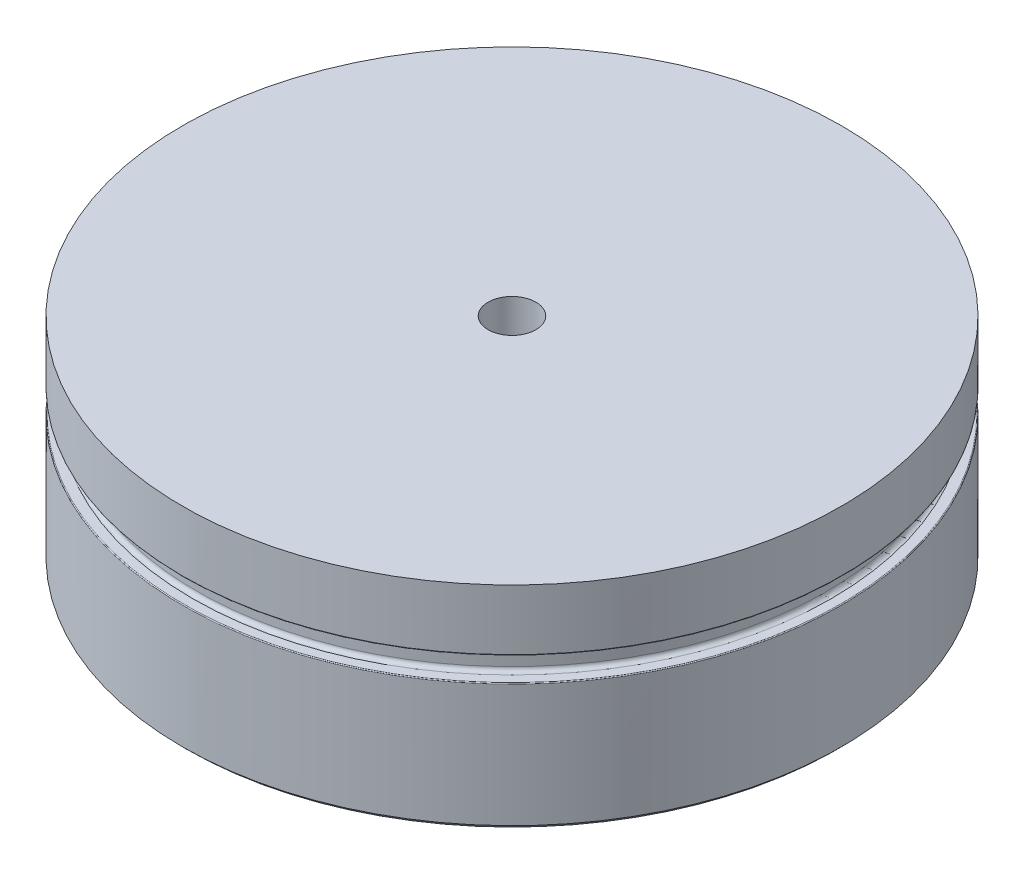
ISO-10303-21;
HEADER;
FILE_DESCRIPTION(('STEP AP214'),'2;1');
FILE_NAME('part.step','',(''),(''),'','','');
FILE_SCHEMA(('AUTOMOTIVE_DESIGN { 1 0 10303 214 1 1 1 1 }'));
ENDSEC;
DATA;
#1=APPLICATION_CONTEXT('core data for automotive mechanical design processes');
#2=APPLICATION_PROTOCOL_DEFINITION('international standard','automotive_design',2000,#1);
#3=PRODUCT_CONTEXT('',#1,'mechanical');
#4=PRODUCT('Part','Part','',(#3));
#5=PRODUCT_RELATED_PRODUCT_CATEGORY('part','',(#4));
#6=PRODUCT_DEFINITION_FORMATION('','',#4);
#7=PRODUCT_DEFINITION_CONTEXT('part definition',#1,'design');
#8=PRODUCT_DEFINITION('design','',#6,#7);
#9=PRODUCT_DEFINITION_SHAPE('','',#8);
#10=(LENGTH_UNIT() NAMED_UNIT(*) SI_UNIT(.MILLI.,.METRE.));
#11=(NAMED_UNIT(*) PLANE_ANGLE_UNIT() SI_UNIT($,.RADIAN.));
#12=(NAMED_UNIT(*) SI_UNIT($,.STERADIAN.) SOLID_ANGLE_UNIT());
#13=UNCERTAINTY_MEASURE_WITH_UNIT(LENGTH_MEASURE(1.E-05),#10,'distance_accuracy_value','');
#14=(GEOMETRIC_REPRESENTATION_CONTEXT(3) GLOBAL_UNCERTAINTY_ASSIGNED_CONTEXT((#13)) GLOBAL_UNIT_ASSIGNED_CONTEXT((#10,
#11,#12)) REPRESENTATION_CONTEXT('',''));
#15=CARTESIAN_POINT('',(0.,0.,0.));
#16=DIRECTION('',(0.,0.,1.));
#17=DIRECTION('',(1.,0.,0.));
#18=AXIS2_PLACEMENT_3D('',#15,#16,#17);
#19=CARTESIAN_POINT('',(-98.3869,0.,0.));
#20=DIRECTION('',(0.,1.,0.));
#21=DIRECTION('',(0.,0.,1.));
#22=AXIS2_PLACEMENT_3D('',#19,#20,#21);
#23=PLANE('',#22);
#24=CARTESIAN_POINT('',(0.,0.,0.));
#25=DIRECTION('',(0.,-1.,0.));
#26=DIRECTION('',(0.,0.,-1.));
#27=AXIS2_PLACEMENT_3D('',#24,#25,#26);
#28=CIRCLE('',#27,8.5727413);
#29=CARTESIAN_POINT('',(0.,0.,-8.5727413));
#30=VERTEX_POINT('',#29);
#31=EDGE_CURVE('E89',#30,#30,#28,.T.);
#32=ORIENTED_EDGE('',*,*,#31,.F.);
#33=EDGE_LOOP('',(#32));
#34=FACE_BOUND('',#33,.T.);
#35=CARTESIAN_POINT('',(0.,0.,0.));
#36=DIRECTION('',(0.,1.,0.));
#37=DIRECTION('',(0.,0.,1.));
#38=AXIS2_PLACEMENT_3D('',#35,#36,#37);
#39=CIRCLE('',#38,97.1168999999999);
#40=CARTESIAN_POINT('',(0.,0.,97.1168999999999));
#41=VERTEX_POINT('',#40);
#42=EDGE_CURVE('E50',#41,#41,#39,.F.);
#43=ORIENTED_EDGE('',*,*,#42,.T.);
#44=EDGE_LOOP('',(#43));
#45=FACE_BOUND('',#44,.T.);
#46=ADVANCED_FACE('F39',(#34,#45),#23,.F.);
#47=CARTESIAN_POINT('',(0.,63.5,0.));
#48=DIRECTION('',(0.,-1.,0.));
#49=DIRECTION('',(0.,0.,-1.));
#50=AXIS2_PLACEMENT_3D('',#47,#48,#49);
#51=PLANE('',#50);
#52=CARTESIAN_POINT('',(0.,63.5,0.));
#53=DIRECTION('',(0.,-1.,0.));
#54=DIRECTION('',(0.,0.,-1.));
#55=AXIS2_PLACEMENT_3D('',#52,#53,#54);
#56=CIRCLE('',#55,7.1374);
#57=CARTESIAN_POINT('',(0.,63.5,-7.1374));
#58=VERTEX_POINT('',#57);
#59=EDGE_CURVE('E82',#58,#58,#56,.T.);
#60=ORIENTED_EDGE('',*,*,#59,.T.);
#61=EDGE_LOOP('',(#60));
#62=FACE_BOUND('',#61,.T.);
#63=CARTESIAN_POINT('',(0.,63.5,0.));
#64=DIRECTION('',(0.,-1.,0.));
#65=DIRECTION('',(0.,0.,-1.));
#66=AXIS2_PLACEMENT_3D('',#63,#64,#65);
#67=CIRCLE('',#66,98.3869);
#68=CARTESIAN_POINT('',(0.,63.5,-98.3869));
#69=VERTEX_POINT('',#68);
#70=EDGE_CURVE('E76',#69,#69,#67,.T.);
#71=ORIENTED_EDGE('',*,*,#70,.F.);
#72=EDGE_LOOP('',(#71));
#73=FACE_BOUND('',#72,.T.);
#74=ADVANCED_FACE('F100',(#62,#73),#51,.F.);
#75=CARTESIAN_POINT('',(0.,0.,0.));
#76=DIRECTION('',(0.,-1.,0.));
#77=DIRECTION('',(0.,0.,-1.));
#78=AXIS2_PLACEMENT_3D('',#75,#76,#77);
#79=CYLINDRICAL_SURFACE('',#78,98.3869);
#80=CARTESIAN_POINT('',(0.,45.4914,0.));
#81=DIRECTION('',(0.,1.,0.));
#82=DIRECTION('',(0.,0.,1.));
#83=AXIS2_PLACEMENT_3D('',#80,#81,#82);
#84=CIRCLE('',#83,98.3869);
#85=CARTESIAN_POINT('',(0.,45.4914,98.3869));
#86=VERTEX_POINT('',#85);
#87=EDGE_CURVE('E51',#86,#86,#84,.T.);
#88=ORIENTED_EDGE('',*,*,#87,.T.);
#89=EDGE_LOOP('',(#88));
#90=FACE_BOUND('',#89,.T.);
#91=ORIENTED_EDGE('',*,*,#70,.T.);
#92=EDGE_LOOP('',(#91));
#93=FACE_BOUND('',#92,.T.);
#94=ADVANCED_FACE('F103',(#90,#93),#79,.T.);
#95=CARTESIAN_POINT('',(-98.3869,45.2374,0.));
#96=DIRECTION('',(0.,1.,0.));
#97=DIRECTION('',(0.,0.,1.));
#98=AXIS2_PLACEMENT_3D('',#95,#96,#97);
#99=PLANE('',#98);
#100=CARTESIAN_POINT('',(0.,45.2374,0.));
#101=DIRECTION('',(0.,1.,0.));
#102=DIRECTION('',(0.,0.,1.));
#103=AXIS2_PLACEMENT_3D('',#100,#101,#102);
#104=CIRCLE('',#103,98.1329);
#105=CARTESIAN_POINT('',(0.,45.2374,98.1329));
#106=VERTEX_POINT('',#105);
#107=EDGE_CURVE('E54',#106,#106,#104,.F.);
#108=ORIENTED_EDGE('',*,*,#107,.T.);
#109=EDGE_LOOP('',(#108));
#110=FACE_BOUND('',#109,.T.);
#111=CARTESIAN_POINT('',(0.,45.2374,0.));
#112=DIRECTION('',(0.,1.,0.));
#113=DIRECTION('',(0.,0.,1.));
#114=AXIS2_PLACEMENT_3D('',#111,#112,#113);
#115=CIRCLE('',#114,95.377);
#116=CARTESIAN_POINT('',(0.,45.2374,95.377));
#117=VERTEX_POINT('',#116);
#118=EDGE_CURVE('E66',#117,#117,#115,.T.);
#119=ORIENTED_EDGE('',*,*,#118,.T.);
#120=EDGE_LOOP('',(#119));
#121=FACE_BOUND('',#120,.T.);
#122=ADVANCED_FACE('F135',(#110,#121),#99,.F.);
#123=CARTESIAN_POINT('',(0.,0.,0.));
#124=DIRECTION('',(0.,-1.,0.));
#125=DIRECTION('',(0.,0.,-1.));
#126=AXIS2_PLACEMENT_3D('',#123,#124,#125);
#127=CYLINDRICAL_SURFACE('',#126,94.107);
#128=CARTESIAN_POINT('',(0.,43.9674,0.));
#129=DIRECTION('',(0.,1.,0.));
#130=DIRECTION('',(0.,0.,1.));
#131=AXIS2_PLACEMENT_3D('',#128,#129,#130);
#132=CIRCLE('',#131,94.107);
#133=CARTESIAN_POINT('',(0.,43.9674,94.107));
#134=VERTEX_POINT('',#133);
#135=EDGE_CURVE('E75',#134,#134,#132,.F.);
#136=ORIENTED_EDGE('',*,*,#135,.T.);
#137=EDGE_LOOP('',(#136));
#138=FACE_BOUND('',#137,.T.);
#139=CARTESIAN_POINT('',(0.,39.37,0.));
#140=DIRECTION('',(0.,-1.,0.));
#141=DIRECTION('',(0.,0.,-1.));
#142=AXIS2_PLACEMENT_3D('',#139,#140,#141);
#143=CIRCLE('',#142,94.107);
#144=CARTESIAN_POINT('',(0.,39.37,-94.107));
#145=VERTEX_POINT('',#144);
#146=EDGE_CURVE('E73',#145,#145,#143,.F.);
#147=ORIENTED_EDGE('',*,*,#146,.T.);
#148=EDGE_LOOP('',(#147));
#149=FACE_BOUND('',#148,.T.);
#150=ADVANCED_FACE('F134',(#138,#149),#127,.T.);
#151=CARTESIAN_POINT('',(-94.107,38.1,0.));
#152=DIRECTION('',(0.,-1.,0.));
#153=DIRECTION('',(0.,0.,-1.));
#154=AXIS2_PLACEMENT_3D('',#151,#152,#153);
#155=PLANE('',#154);
#156=CARTESIAN_POINT('',(0.,38.1,0.));
#157=DIRECTION('',(0.,-1.,0.));
#158=DIRECTION('',(0.,0.,-1.));
#159=AXIS2_PLACEMENT_3D('',#156,#157,#158);
#160=CIRCLE('',#159,98.1329);
#161=CARTESIAN_POINT('',(0.,38.1,-98.1329));
#162=VERTEX_POINT('',#161);
#163=EDGE_CURVE('E58',#162,#162,#160,.F.);
#164=ORIENTED_EDGE('',*,*,#163,.T.);
#165=EDGE_LOOP('',(#164));
#166=FACE_BOUND('',#165,.T.);
#167=CARTESIAN_POINT('',(0.,38.1,0.));
#168=DIRECTION('',(0.,-1.,0.));
#169=DIRECTION('',(0.,0.,-1.));
#170=AXIS2_PLACEMENT_3D('',#167,#168,#169);
#171=CIRCLE('',#170,95.377);
#172=CARTESIAN_POINT('',(0.,38.1,-95.377));
#173=VERTEX_POINT('',#172);
#174=EDGE_CURVE('E67',#173,#173,#171,.T.);
#175=ORIENTED_EDGE('',*,*,#174,.T.);
#176=EDGE_LOOP('',(#175));
#177=FACE_BOUND('',#176,.T.);
#178=ADVANCED_FACE('F141',(#166,#177),#155,.F.);
#179=CARTESIAN_POINT('',(0.,0.,0.));
#180=DIRECTION('',(0.,-1.,0.));
#181=DIRECTION('',(0.,0.,-1.));
#182=AXIS2_PLACEMENT_3D('',#179,#180,#181);
#183=CYLINDRICAL_SURFACE('',#182,98.3869);
#184=CARTESIAN_POINT('',(0.,1.27000000000004,0.));
#185=DIRECTION('',(0.,1.,0.));
#186=DIRECTION('',(0.,0.,1.));
#187=AXIS2_PLACEMENT_3D('',#184,#185,#186);
#188=CIRCLE('',#187,98.3869);
#189=CARTESIAN_POINT('',(0.,1.27000000000004,98.3869));
#190=VERTEX_POINT('',#189);
#191=EDGE_CURVE('E10',#190,#190,#188,.T.);
#192=ORIENTED_EDGE('',*,*,#191,.T.);
#193=EDGE_LOOP('',(#192));
#194=FACE_BOUND('',#193,.T.);
#195=CARTESIAN_POINT('',(0.,37.846,0.));
#196=DIRECTION('',(0.,-1.,0.));
#197=DIRECTION('',(0.,0.,-1.));
#198=AXIS2_PLACEMENT_3D('',#195,#196,#197);
#199=CIRCLE('',#198,98.3869);
#200=CARTESIAN_POINT('',(0.,37.846,-98.3869));
#201=VERTEX_POINT('',#200);
#202=EDGE_CURVE('E61',#201,#201,#199,.T.);
#203=ORIENTED_EDGE('',*,*,#202,.T.);
#204=EDGE_LOOP('',(#203));
#205=FACE_BOUND('',#204,.T.);
#206=ADVANCED_FACE('F115',(#194,#205),#183,.T.);
#207=CARTESIAN_POINT('',(0.,43.9674,0.));
#208=DIRECTION('',(0.,1.,0.));
#209=DIRECTION('',(0.,0.,1.));
#210=AXIS2_PLACEMENT_3D('',#207,#208,#209);
#211=TOROIDAL_SURFACE('',#210,95.377,1.27);
#212=ORIENTED_EDGE('',*,*,#118,.F.);
#213=EDGE_LOOP('',(#212));
#214=FACE_BOUND('',#213,.T.);
#215=ORIENTED_EDGE('',*,*,#135,.F.);
#216=EDGE_LOOP('',(#215));
#217=FACE_BOUND('',#216,.T.);
#218=ADVANCED_FACE('F107',(#214,#217),#211,.F.);
#219=CARTESIAN_POINT('',(0.,39.37,0.));
#220=DIRECTION('',(0.,-1.,0.));
#221=DIRECTION('',(0.,0.,-1.));
#222=AXIS2_PLACEMENT_3D('',#219,#220,#221);
#223=TOROIDAL_SURFACE('',#222,95.377,1.27);
#224=ORIENTED_EDGE('',*,*,#146,.F.);
#225=EDGE_LOOP('',(#224));
#226=FACE_BOUND('',#225,.T.);
#227=ORIENTED_EDGE('',*,*,#174,.F.);
#228=EDGE_LOOP('',(#227));
#229=FACE_BOUND('',#228,.T.);
#230=ADVANCED_FACE('F112',(#226,#229),#223,.F.);
#231=CARTESIAN_POINT('',(0.,37.846,0.));
#232=DIRECTION('',(0.,-1.,0.));
#233=DIRECTION('',(0.,0.,-1.));
#234=AXIS2_PLACEMENT_3D('',#231,#232,#233);
#235=TOROIDAL_SURFACE('',#234,98.1329,0.254);
#236=ORIENTED_EDGE('',*,*,#163,.F.);
#237=EDGE_LOOP('',(#236));
#238=FACE_BOUND('',#237,.T.);
#239=ORIENTED_EDGE('',*,*,#202,.F.);
#240=EDGE_LOOP('',(#239));
#241=FACE_BOUND('',#240,.T.);
#242=ADVANCED_FACE('F118',(#238,#241),#235,.T.);
#243=CARTESIAN_POINT('',(0.,45.4914,0.));
#244=DIRECTION('',(0.,1.,0.));
#245=DIRECTION('',(0.,0.,1.));
#246=AXIS2_PLACEMENT_3D('',#243,#244,#245);
#247=TOROIDAL_SURFACE('',#246,98.1329,0.254);
#248=ORIENTED_EDGE('',*,*,#87,.F.);
#249=EDGE_LOOP('',(#248));
#250=FACE_BOUND('',#249,.T.);
#251=ORIENTED_EDGE('',*,*,#107,.F.);
#252=EDGE_LOOP('',(#251));
#253=FACE_BOUND('',#252,.T.);
#254=ADVANCED_FACE('F117',(#250,#253),#247,.T.);
#255=CARTESIAN_POINT('',(0.,0.,0.));
#256=DIRECTION('',(0.,1.,0.));
#257=DIRECTION('',(0.,0.,1.));
#258=AXIS2_PLACEMENT_3D('',#255,#256,#257);
#259=CONICAL_SURFACE('',#258,97.1168999999999,0.785398163397459);
#260=ORIENTED_EDGE('',*,*,#191,.F.);
#261=EDGE_LOOP('',(#260));
#262=FACE_BOUND('',#261,.T.);
#263=ORIENTED_EDGE('',*,*,#42,.F.);
#264=EDGE_LOOP('',(#263));
#265=FACE_BOUND('',#264,.T.);
#266=ADVANCED_FACE('F45',(#262,#265),#259,.T.);
#267=CARTESIAN_POINT('',(0.,0.,0.));
#268=DIRECTION('',(0.,-1.,0.));
#269=DIRECTION('',(0.,0.,-1.));
#270=AXIS2_PLACEMENT_3D('',#267,#268,#269);
#271=CYLINDRICAL_SURFACE('',#270,7.13740000000001);
#272=ORIENTED_EDGE('',*,*,#59,.F.);
#273=EDGE_LOOP('',(#272));
#274=FACE_BOUND('',#273,.T.);
#275=CARTESIAN_POINT('',(0.,10.3378,0.));
#276=DIRECTION('',(0.,-1.,0.));
#277=DIRECTION('',(0.,0.,-1.));
#278=AXIS2_PLACEMENT_3D('',#275,#276,#277);
#279=CIRCLE('',#278,7.13740000000001);
#280=CARTESIAN_POINT('',(0.,10.3378,-7.13740000000001));
#281=VERTEX_POINT('',#280);
#282=EDGE_CURVE('E81',#281,#281,#279,.T.);
#283=ORIENTED_EDGE('',*,*,#282,.T.);
#284=EDGE_LOOP('',(#283));
#285=FACE_BOUND('',#284,.T.);
#286=ADVANCED_FACE('F127',(#274,#285),#271,.F.);
#287=CARTESIAN_POINT('',(7.13740000000001,10.3378,0.));
#288=DIRECTION('',(0.,1.,0.));
#289=DIRECTION('',(0.,0.,1.));
#290=AXIS2_PLACEMENT_3D('',#287,#288,#289);
#291=PLANE('',#290);
#292=ORIENTED_EDGE('',*,*,#282,.F.);
#293=EDGE_LOOP('',(#292));
#294=FACE_BOUND('',#293,.T.);
#295=CARTESIAN_POINT('',(0.,10.3378,0.));
#296=DIRECTION('',(0.,-1.,0.));
#297=DIRECTION('',(0.,0.,-1.));
#298=AXIS2_PLACEMENT_3D('',#295,#296,#297);
#299=CIRCLE('',#298,8.25000302407812);
#300=CARTESIAN_POINT('',(0.,10.3378,-8.25000302407812));
#301=VERTEX_POINT('',#300);
#302=EDGE_CURVE('E87',#301,#301,#299,.T.);
#303=ORIENTED_EDGE('',*,*,#302,.T.);
#304=EDGE_LOOP('',(#303));
#305=FACE_BOUND('',#304,.T.);
#306=ADVANCED_FACE('F228',(#294,#305),#291,.F.);
#307=CARTESIAN_POINT('',(0.,0.,0.));
#308=DIRECTION('',(0.,-1.,0.));
#309=DIRECTION('',(0.,0.,-1.));
#310=AXIS2_PLACEMENT_3D('',#307,#308,#309);
#311=CONICAL_SURFACE('',#310,8.5727413,0.031209105019538);
#312=ORIENTED_EDGE('',*,*,#302,.F.);
#313=EDGE_LOOP('',(#312));
#314=FACE_BOUND('',#313,.T.);
#315=ORIENTED_EDGE('',*,*,#31,.T.);
#316=EDGE_LOOP('',(#315));
#317=FACE_BOUND('',#316,.T.);
#318=ADVANCED_FACE('F94',(#314,#317),#311,.F.);
#319=CLOSED_SHELL('',(#46,#74,#94,#122,#150,#178,#206,#218,#230,#242,#254,#266,#286,#306,#318));
#320=MANIFOLD_SOLID_BREP('B2',#319);
#321=ADVANCED_BREP_SHAPE_REPRESENTATION('',(#18,#320),#14);
#322=SHAPE_DEFINITION_REPRESENTATION(#9,#321);
ENDSEC;
END-ISO-10303-21;
